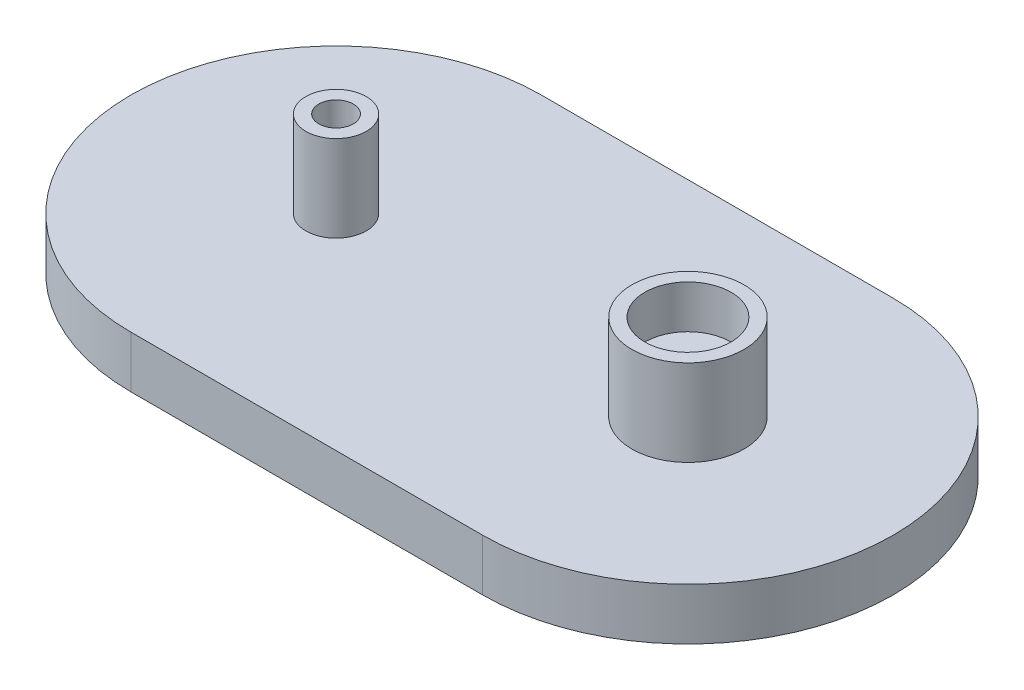
ISO-10303-21;
HEADER;
FILE_DESCRIPTION(('STEP AP214'),'2;1');
FILE_NAME('part.step','',(''),(''),'','','');
FILE_SCHEMA(('AUTOMOTIVE_DESIGN { 1 0 10303 214 1 1 1 1 }'));
ENDSEC;
DATA;
#1=APPLICATION_CONTEXT('core data for automotive mechanical design processes');
#2=APPLICATION_PROTOCOL_DEFINITION('international standard','automotive_design',2000,#1);
#3=PRODUCT_CONTEXT('',#1,'mechanical');
#4=PRODUCT('Part','Part','',(#3));
#5=PRODUCT_RELATED_PRODUCT_CATEGORY('part','',(#4));
#6=PRODUCT_DEFINITION_FORMATION('','',#4);
#7=PRODUCT_DEFINITION_CONTEXT('part definition',#1,'design');
#8=PRODUCT_DEFINITION('design','',#6,#7);
#9=PRODUCT_DEFINITION_SHAPE('','',#8);
#10=(LENGTH_UNIT() NAMED_UNIT(*) SI_UNIT(.MILLI.,.METRE.));
#11=(NAMED_UNIT(*) PLANE_ANGLE_UNIT() SI_UNIT($,.RADIAN.));
#12=(NAMED_UNIT(*) SI_UNIT($,.STERADIAN.) SOLID_ANGLE_UNIT());
#13=UNCERTAINTY_MEASURE_WITH_UNIT(LENGTH_MEASURE(1.E-05),#10,'distance_accuracy_value','');
#14=(GEOMETRIC_REPRESENTATION_CONTEXT(3) GLOBAL_UNCERTAINTY_ASSIGNED_CONTEXT((#13)) GLOBAL_UNIT_ASSIGNED_CONTEXT((#10,
#11,#12)) REPRESENTATION_CONTEXT('',''));
#15=CARTESIAN_POINT('',(0.,0.,0.));
#16=DIRECTION('',(0.,0.,1.));
#17=DIRECTION('',(1.,0.,0.));
#18=AXIS2_PLACEMENT_3D('',#15,#16,#17);
#19=CARTESIAN_POINT('',(10.2,3.,0.));
#20=DIRECTION('',(0.,-1.,0.));
#21=DIRECTION('',(0.,0.,-1.));
#22=AXIS2_PLACEMENT_3D('',#19,#20,#21);
#23=CYLINDRICAL_SURFACE('',#22,11.9);
#24=CARTESIAN_POINT('',(10.2,0.,0.));
#25=DIRECTION('',(0.,1.,0.));
#26=DIRECTION('',(0.,0.,1.));
#27=AXIS2_PLACEMENT_3D('',#24,#25,#26);
#28=CIRCLE('',#27,11.9);
#29=CARTESIAN_POINT('',(10.2,0.,11.9));
#30=VERTEX_POINT('',#29);
#31=CARTESIAN_POINT('',(10.2,0.,-11.9));
#32=VERTEX_POINT('',#31);
#33=EDGE_CURVE('E98',#30,#32,#28,.T.);
#34=ORIENTED_EDGE('',*,*,#33,.T.);
#35=DIRECTION('',(0.,-1.,0.));
#36=VECTOR('',#35,1.);
#37=CARTESIAN_POINT('',(10.2,3.,-11.9));
#38=LINE('',#37,#36);
#39=CARTESIAN_POINT('',(10.2,3.,-11.9));
#40=VERTEX_POINT('',#39);
#41=EDGE_CURVE('E11',#40,#32,#38,.T.);
#42=ORIENTED_EDGE('',*,*,#41,.F.);
#43=CARTESIAN_POINT('',(10.2,3.,0.));
#44=DIRECTION('',(0.,1.,0.));
#45=DIRECTION('',(0.,0.,1.));
#46=AXIS2_PLACEMENT_3D('',#43,#44,#45);
#47=CIRCLE('',#46,11.9);
#48=CARTESIAN_POINT('',(10.2,3.,11.9));
#49=VERTEX_POINT('',#48);
#50=EDGE_CURVE('E86',#49,#40,#47,.T.);
#51=ORIENTED_EDGE('',*,*,#50,.F.);
#52=DIRECTION('',(0.,-1.,0.));
#53=VECTOR('',#52,1.);
#54=CARTESIAN_POINT('',(10.2,3.,11.9));
#55=LINE('',#54,#53);
#56=EDGE_CURVE('E94',#49,#30,#55,.T.);
#57=ORIENTED_EDGE('',*,*,#56,.T.);
#58=EDGE_LOOP('',(#34,#42,#51,#57));
#59=FACE_BOUND('',#58,.T.);
#60=ADVANCED_FACE('F35',(#59),#23,.T.);
#61=CARTESIAN_POINT('',(10.2,3.,-11.9));
#62=DIRECTION('',(0.,0.,1.));
#63=DIRECTION('',(1.,0.,0.));
#64=AXIS2_PLACEMENT_3D('',#61,#62,#63);
#65=PLANE('',#64);
#66=DIRECTION('',(-1.,0.,0.));
#67=VECTOR('',#66,1.);
#68=CARTESIAN_POINT('',(10.2,0.,-11.9));
#69=LINE('',#68,#67);
#70=CARTESIAN_POINT('',(-10.2,0.,-11.9));
#71=VERTEX_POINT('',#70);
#72=EDGE_CURVE('E90',#32,#71,#69,.T.);
#73=ORIENTED_EDGE('',*,*,#72,.T.);
#74=DIRECTION('',(0.,-1.,0.));
#75=VECTOR('',#74,1.);
#76=CARTESIAN_POINT('',(-10.2,3.,-11.9));
#77=LINE('',#76,#75);
#78=CARTESIAN_POINT('',(-10.2,3.,-11.9));
#79=VERTEX_POINT('',#78);
#80=EDGE_CURVE('E43',#79,#71,#77,.T.);
#81=ORIENTED_EDGE('',*,*,#80,.F.);
#82=DIRECTION('',(-1.,0.,0.));
#83=VECTOR('',#82,1.);
#84=CARTESIAN_POINT('',(10.2,3.,-11.9));
#85=LINE('',#84,#83);
#86=EDGE_CURVE('E81',#40,#79,#85,.T.);
#87=ORIENTED_EDGE('',*,*,#86,.F.);
#88=ORIENTED_EDGE('',*,*,#41,.T.);
#89=EDGE_LOOP('',(#73,#81,#87,#88));
#90=FACE_BOUND('',#89,.T.);
#91=ADVANCED_FACE('F89',(#90),#65,.F.);
#92=CARTESIAN_POINT('',(-10.2,3.,0.));
#93=DIRECTION('',(0.,-1.,0.));
#94=DIRECTION('',(0.,0.,-1.));
#95=AXIS2_PLACEMENT_3D('',#92,#93,#94);
#96=CYLINDRICAL_SURFACE('',#95,11.9);
#97=CARTESIAN_POINT('',(-10.2,0.,0.));
#98=DIRECTION('',(0.,1.,0.));
#99=DIRECTION('',(0.,0.,1.));
#100=AXIS2_PLACEMENT_3D('',#97,#98,#99);
#101=CIRCLE('',#100,11.9);
#102=CARTESIAN_POINT('',(-10.2,0.,11.9));
#103=VERTEX_POINT('',#102);
#104=EDGE_CURVE('E68',#71,#103,#101,.T.);
#105=ORIENTED_EDGE('',*,*,#104,.T.);
#106=DIRECTION('',(0.,-1.,0.));
#107=VECTOR('',#106,1.);
#108=CARTESIAN_POINT('',(-10.2,3.,11.9));
#109=LINE('',#108,#107);
#110=CARTESIAN_POINT('',(-10.2,3.,11.9));
#111=VERTEX_POINT('',#110);
#112=EDGE_CURVE('E91',#111,#103,#109,.T.);
#113=ORIENTED_EDGE('',*,*,#112,.F.);
#114=CARTESIAN_POINT('',(-10.2,3.,0.));
#115=DIRECTION('',(0.,1.,0.));
#116=DIRECTION('',(0.,0.,1.));
#117=AXIS2_PLACEMENT_3D('',#114,#115,#116);
#118=CIRCLE('',#117,11.9);
#119=EDGE_CURVE('E84',#79,#111,#118,.T.);
#120=ORIENTED_EDGE('',*,*,#119,.F.);
#121=ORIENTED_EDGE('',*,*,#80,.T.);
#122=EDGE_LOOP('',(#105,#113,#120,#121));
#123=FACE_BOUND('',#122,.T.);
#124=ADVANCED_FACE('F92',(#123),#96,.T.);
#125=CARTESIAN_POINT('',(10.2,3.,11.9));
#126=DIRECTION('',(0.,0.,-1.));
#127=DIRECTION('',(-1.,0.,0.));
#128=AXIS2_PLACEMENT_3D('',#125,#126,#127);
#129=PLANE('',#128);
#130=DIRECTION('',(1.,0.,0.));
#131=VECTOR('',#130,1.);
#132=CARTESIAN_POINT('',(10.2,0.,11.9));
#133=LINE('',#132,#131);
#134=EDGE_CURVE('E74',#103,#30,#133,.T.);
#135=ORIENTED_EDGE('',*,*,#134,.T.);
#136=ORIENTED_EDGE('',*,*,#56,.F.);
#137=DIRECTION('',(1.,0.,0.));
#138=VECTOR('',#137,1.);
#139=CARTESIAN_POINT('',(10.2,3.,11.9));
#140=LINE('',#139,#138);
#141=EDGE_CURVE('E51',#111,#49,#140,.T.);
#142=ORIENTED_EDGE('',*,*,#141,.F.);
#143=ORIENTED_EDGE('',*,*,#112,.T.);
#144=EDGE_LOOP('',(#135,#136,#142,#143));
#145=FACE_BOUND('',#144,.T.);
#146=ADVANCED_FACE('F106',(#145),#129,.F.);
#147=CARTESIAN_POINT('',(10.2,3.,0.));
#148=DIRECTION('',(0.,1.,0.));
#149=DIRECTION('',(0.,0.,1.));
#150=AXIS2_PLACEMENT_3D('',#147,#148,#149);
#151=PLANE('',#150);
#152=CARTESIAN_POINT('',(10.2,3.,0.));
#153=DIRECTION('',(0.,1.,0.));
#154=DIRECTION('',(0.,0.,1.));
#155=AXIS2_PLACEMENT_3D('',#152,#153,#154);
#156=CIRCLE('',#155,3.25);
#157=CARTESIAN_POINT('',(10.2,3.,3.25));
#158=VERTEX_POINT('',#157);
#159=EDGE_CURVE('E115',#158,#158,#156,.T.);
#160=ORIENTED_EDGE('',*,*,#159,.F.);
#161=EDGE_LOOP('',(#160));
#162=FACE_BOUND('',#161,.T.);
#163=CARTESIAN_POINT('',(-10.2,3.,0.));
#164=DIRECTION('',(0.,1.,0.));
#165=DIRECTION('',(0.,0.,1.));
#166=AXIS2_PLACEMENT_3D('',#163,#164,#165);
#167=CIRCLE('',#166,1.75);
#168=CARTESIAN_POINT('',(-10.2,3.,1.75));
#169=VERTEX_POINT('',#168);
#170=EDGE_CURVE('E112',#169,#169,#167,.T.);
#171=ORIENTED_EDGE('',*,*,#170,.F.);
#172=EDGE_LOOP('',(#171));
#173=FACE_BOUND('',#172,.T.);
#174=ORIENTED_EDGE('',*,*,#50,.T.);
#175=ORIENTED_EDGE('',*,*,#86,.T.);
#176=ORIENTED_EDGE('',*,*,#119,.T.);
#177=ORIENTED_EDGE('',*,*,#141,.T.);
#178=EDGE_LOOP('',(#174,#175,#176,#177));
#179=FACE_BOUND('',#178,.T.);
#180=ADVANCED_FACE('F82',(#162,#173,#179),#151,.T.);
#181=CARTESIAN_POINT('',(10.2,0.,0.));
#182=DIRECTION('',(0.,1.,0.));
#183=DIRECTION('',(0.,0.,1.));
#184=AXIS2_PLACEMENT_3D('',#181,#182,#183);
#185=PLANE('',#184);
#186=ORIENTED_EDGE('',*,*,#33,.F.);
#187=ORIENTED_EDGE('',*,*,#134,.F.);
#188=ORIENTED_EDGE('',*,*,#104,.F.);
#189=ORIENTED_EDGE('',*,*,#72,.F.);
#190=EDGE_LOOP('',(#186,#187,#188,#189));
#191=FACE_BOUND('',#190,.T.);
#192=ADVANCED_FACE('F109',(#191),#185,.F.);
#193=CARTESIAN_POINT('',(-10.2,8.,0.));
#194=DIRECTION('',(0.,-1.,0.));
#195=DIRECTION('',(0.,0.,-1.));
#196=AXIS2_PLACEMENT_3D('',#193,#194,#195);
#197=CYLINDRICAL_SURFACE('',#196,1.75);
#198=CARTESIAN_POINT('',(-10.2,8.,0.));
#199=DIRECTION('',(0.,1.,0.));
#200=DIRECTION('',(0.,0.,1.));
#201=AXIS2_PLACEMENT_3D('',#198,#199,#200);
#202=CIRCLE('',#201,1.75);
#203=CARTESIAN_POINT('',(-10.2,8.,1.75));
#204=VERTEX_POINT('',#203);
#205=EDGE_CURVE('E101',#204,#204,#202,.T.);
#206=ORIENTED_EDGE('',*,*,#205,.F.);
#207=EDGE_LOOP('',(#206));
#208=FACE_BOUND('',#207,.T.);
#209=ORIENTED_EDGE('',*,*,#170,.T.);
#210=EDGE_LOOP('',(#209));
#211=FACE_BOUND('',#210,.T.);
#212=ADVANCED_FACE('F162',(#208,#211),#197,.T.);
#213=CARTESIAN_POINT('',(-10.2,8.,0.));
#214=DIRECTION('',(0.,1.,0.));
#215=DIRECTION('',(0.,0.,1.));
#216=AXIS2_PLACEMENT_3D('',#213,#214,#215);
#217=PLANE('',#216);
#218=CARTESIAN_POINT('',(-10.2,8.,0.));
#219=DIRECTION('',(0.,1.,0.));
#220=DIRECTION('',(0.,0.,1.));
#221=AXIS2_PLACEMENT_3D('',#218,#219,#220);
#222=CIRCLE('',#221,1.);
#223=CARTESIAN_POINT('',(-10.2,8.,1.));
#224=VERTEX_POINT('',#223);
#225=EDGE_CURVE('E127',#224,#224,#222,.T.);
#226=ORIENTED_EDGE('',*,*,#225,.F.);
#227=EDGE_LOOP('',(#226));
#228=FACE_BOUND('',#227,.T.);
#229=ORIENTED_EDGE('',*,*,#205,.T.);
#230=EDGE_LOOP('',(#229));
#231=FACE_BOUND('',#230,.T.);
#232=ADVANCED_FACE('F153',(#228,#231),#217,.T.);
#233=CARTESIAN_POINT('',(10.2,8.,0.));
#234=DIRECTION('',(0.,-1.,0.));
#235=DIRECTION('',(0.,0.,-1.));
#236=AXIS2_PLACEMENT_3D('',#233,#234,#235);
#237=CYLINDRICAL_SURFACE('',#236,3.25);
#238=CARTESIAN_POINT('',(10.2,8.,0.));
#239=DIRECTION('',(0.,1.,0.));
#240=DIRECTION('',(0.,0.,1.));
#241=AXIS2_PLACEMENT_3D('',#238,#239,#240);
#242=CIRCLE('',#241,3.25);
#243=CARTESIAN_POINT('',(10.2,8.,3.25));
#244=VERTEX_POINT('',#243);
#245=EDGE_CURVE('E118',#244,#244,#242,.T.);
#246=ORIENTED_EDGE('',*,*,#245,.F.);
#247=EDGE_LOOP('',(#246));
#248=FACE_BOUND('',#247,.T.);
#249=ORIENTED_EDGE('',*,*,#159,.T.);
#250=EDGE_LOOP('',(#249));
#251=FACE_BOUND('',#250,.T.);
#252=ADVANCED_FACE('F147',(#248,#251),#237,.T.);
#253=CARTESIAN_POINT('',(10.2,8.,0.));
#254=DIRECTION('',(0.,1.,0.));
#255=DIRECTION('',(0.,0.,1.));
#256=AXIS2_PLACEMENT_3D('',#253,#254,#255);
#257=PLANE('',#256);
#258=CARTESIAN_POINT('',(10.2,8.,0.));
#259=DIRECTION('',(0.,1.,0.));
#260=DIRECTION('',(0.,0.,1.));
#261=AXIS2_PLACEMENT_3D('',#258,#259,#260);
#262=CIRCLE('',#261,2.5);
#263=CARTESIAN_POINT('',(10.2,8.,2.5));
#264=VERTEX_POINT('',#263);
#265=EDGE_CURVE('E130',#264,#264,#262,.T.);
#266=ORIENTED_EDGE('',*,*,#265,.F.);
#267=EDGE_LOOP('',(#266));
#268=FACE_BOUND('',#267,.T.);
#269=ORIENTED_EDGE('',*,*,#245,.T.);
#270=EDGE_LOOP('',(#269));
#271=FACE_BOUND('',#270,.T.);
#272=ADVANCED_FACE('F141',(#268,#271),#257,.T.);
#273=CARTESIAN_POINT('',(10.2,5.5,0.));
#274=DIRECTION('',(0.,1.,0.));
#275=DIRECTION('',(0.,0.,1.));
#276=AXIS2_PLACEMENT_3D('',#273,#274,#275);
#277=CYLINDRICAL_SURFACE('',#276,2.5);
#278=CARTESIAN_POINT('',(10.2,5.5,0.));
#279=DIRECTION('',(0.,1.,0.));
#280=DIRECTION('',(0.,0.,1.));
#281=AXIS2_PLACEMENT_3D('',#278,#279,#280);
#282=CIRCLE('',#281,2.5);
#283=CARTESIAN_POINT('',(10.2,5.5,2.5));
#284=VERTEX_POINT('',#283);
#285=EDGE_CURVE('E121',#284,#284,#282,.T.);
#286=ORIENTED_EDGE('',*,*,#285,.F.);
#287=EDGE_LOOP('',(#286));
#288=FACE_BOUND('',#287,.T.);
#289=ORIENTED_EDGE('',*,*,#265,.T.);
#290=EDGE_LOOP('',(#289));
#291=FACE_BOUND('',#290,.T.);
#292=ADVANCED_FACE('F138',(#288,#291),#277,.F.);
#293=CARTESIAN_POINT('',(10.2,5.5,0.));
#294=DIRECTION('',(0.,1.,0.));
#295=DIRECTION('',(0.,0.,1.));
#296=AXIS2_PLACEMENT_3D('',#293,#294,#295);
#297=PLANE('',#296);
#298=ORIENTED_EDGE('',*,*,#285,.T.);
#299=EDGE_LOOP('',(#298));
#300=FACE_BOUND('',#299,.T.);
#301=ADVANCED_FACE('F136',(#300),#297,.T.);
#302=CARTESIAN_POINT('',(-10.2,5.5,0.));
#303=DIRECTION('',(0.,1.,0.));
#304=DIRECTION('',(0.,0.,1.));
#305=AXIS2_PLACEMENT_3D('',#302,#303,#304);
#306=CYLINDRICAL_SURFACE('',#305,1.);
#307=CARTESIAN_POINT('',(-10.2,5.5,0.));
#308=DIRECTION('',(0.,1.,0.));
#309=DIRECTION('',(0.,0.,1.));
#310=AXIS2_PLACEMENT_3D('',#307,#308,#309);
#311=CIRCLE('',#310,1.);
#312=CARTESIAN_POINT('',(-10.2,5.5,1.));
#313=VERTEX_POINT('',#312);
#314=EDGE_CURVE('E124',#313,#313,#311,.T.);
#315=ORIENTED_EDGE('',*,*,#314,.F.);
#316=EDGE_LOOP('',(#315));
#317=FACE_BOUND('',#316,.T.);
#318=ORIENTED_EDGE('',*,*,#225,.T.);
#319=EDGE_LOOP('',(#318));
#320=FACE_BOUND('',#319,.T.);
#321=ADVANCED_FACE('F232',(#317,#320),#306,.F.);
#322=CARTESIAN_POINT('',(-10.2,5.5,0.));
#323=DIRECTION('',(0.,1.,0.));
#324=DIRECTION('',(0.,0.,1.));
#325=AXIS2_PLACEMENT_3D('',#322,#323,#324);
#326=PLANE('',#325);
#327=ORIENTED_EDGE('',*,*,#314,.T.);
#328=EDGE_LOOP('',(#327));
#329=FACE_BOUND('',#328,.T.);
#330=ADVANCED_FACE('F240',(#329),#326,.T.);
#331=CLOSED_SHELL('',(#60,#91,#124,#146,#180,#192,#212,#232,#252,#272,#292,#301,#321,#330));
#332=MANIFOLD_SOLID_BREP('B2',#331);
#333=ADVANCED_BREP_SHAPE_REPRESENTATION('',(#18,#332),#14);
#334=SHAPE_DEFINITION_REPRESENTATION(#9,#333);
ENDSEC;
END-ISO-10303-21;
